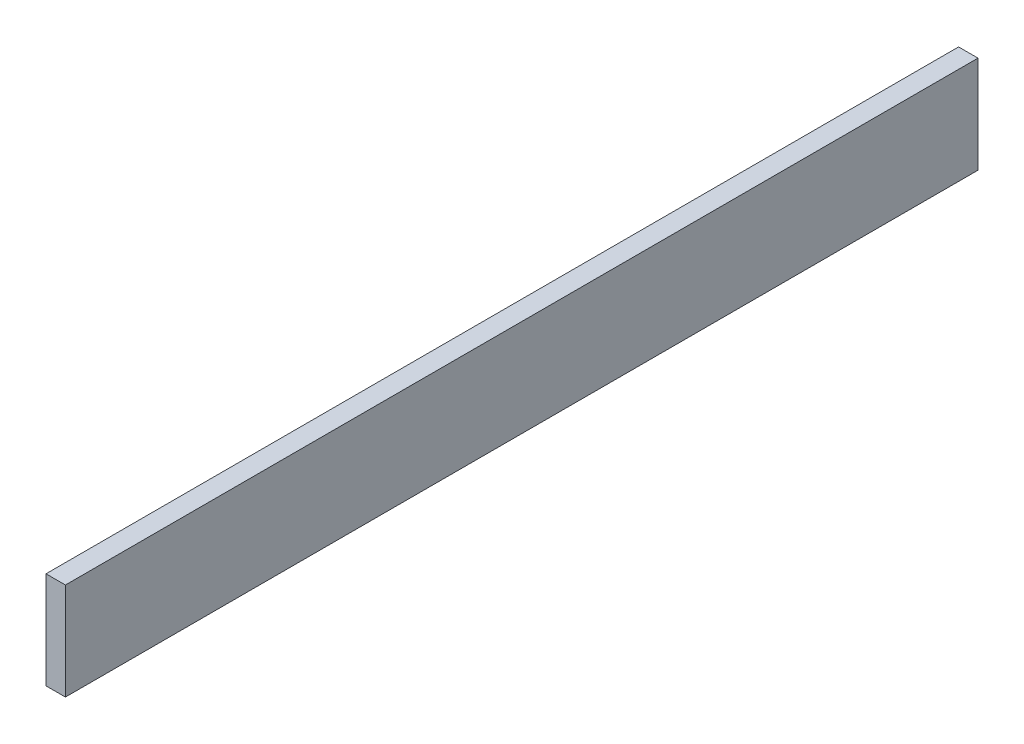
ISO-10303-21;
HEADER;
FILE_DESCRIPTION(('STEP AP214'),'2;1');
FILE_NAME('part.step','',(''),(''),'','','');
FILE_SCHEMA(('AUTOMOTIVE_DESIGN { 1 0 10303 214 1 1 1 1 }'));
ENDSEC;
DATA;
#1=APPLICATION_CONTEXT('core data for automotive mechanical design processes');
#2=APPLICATION_PROTOCOL_DEFINITION('international standard','automotive_design',2000,#1);
#3=PRODUCT_CONTEXT('',#1,'mechanical');
#4=PRODUCT('Part','Part','',(#3));
#5=PRODUCT_RELATED_PRODUCT_CATEGORY('part','',(#4));
#6=PRODUCT_DEFINITION_FORMATION('','',#4);
#7=PRODUCT_DEFINITION_CONTEXT('part definition',#1,'design');
#8=PRODUCT_DEFINITION('design','',#6,#7);
#9=PRODUCT_DEFINITION_SHAPE('','',#8);
#10=(LENGTH_UNIT() NAMED_UNIT(*) SI_UNIT(.MILLI.,.METRE.));
#11=(NAMED_UNIT(*) PLANE_ANGLE_UNIT() SI_UNIT($,.RADIAN.));
#12=(NAMED_UNIT(*) SI_UNIT($,.STERADIAN.) SOLID_ANGLE_UNIT());
#13=UNCERTAINTY_MEASURE_WITH_UNIT(LENGTH_MEASURE(1.E-05),#10,'distance_accuracy_value','');
#14=(GEOMETRIC_REPRESENTATION_CONTEXT(3) GLOBAL_UNCERTAINTY_ASSIGNED_CONTEXT((#13)) GLOBAL_UNIT_ASSIGNED_CONTEXT((#10,
#11,#12)) REPRESENTATION_CONTEXT('',''));
#15=CARTESIAN_POINT('',(0.,0.,0.));
#16=DIRECTION('',(0.,0.,1.));
#17=DIRECTION('',(1.,0.,0.));
#18=AXIS2_PLACEMENT_3D('',#15,#16,#17);
#19=CARTESIAN_POINT('',(10.,0.,0.));
#20=DIRECTION('',(0.,0.,-1.));
#21=DIRECTION('',(-1.,0.,0.));
#22=AXIS2_PLACEMENT_3D('',#19,#20,#21);
#23=PLANE('',#22);
#24=DIRECTION('',(0.,-1.,0.));
#25=VECTOR('',#24,1.);
#26=CARTESIAN_POINT('',(0.,0.,0.));
#27=LINE('',#26,#25);
#28=CARTESIAN_POINT('',(0.,50.,0.));
#29=VERTEX_POINT('',#28);
#30=CARTESIAN_POINT('',(0.,0.,0.));
#31=VERTEX_POINT('',#30);
#32=EDGE_CURVE('E96',#29,#31,#27,.T.);
#33=ORIENTED_EDGE('',*,*,#32,.T.);
#34=DIRECTION('',(-1.,0.,0.));
#35=VECTOR('',#34,1.);
#36=CARTESIAN_POINT('',(10.,0.,0.));
#37=LINE('',#36,#35);
#38=CARTESIAN_POINT('',(10.,0.,0.));
#39=VERTEX_POINT('',#38);
#40=EDGE_CURVE('E11',#39,#31,#37,.T.);
#41=ORIENTED_EDGE('',*,*,#40,.F.);
#42=DIRECTION('',(0.,-1.,0.));
#43=VECTOR('',#42,1.);
#44=CARTESIAN_POINT('',(10.,0.,0.));
#45=LINE('',#44,#43);
#46=CARTESIAN_POINT('',(10.,50.,0.));
#47=VERTEX_POINT('',#46);
#48=EDGE_CURVE('E84',#47,#39,#45,.T.);
#49=ORIENTED_EDGE('',*,*,#48,.F.);
#50=DIRECTION('',(-1.,0.,0.));
#51=VECTOR('',#50,1.);
#52=CARTESIAN_POINT('',(10.,50.,0.));
#53=LINE('',#52,#51);
#54=EDGE_CURVE('E92',#47,#29,#53,.T.);
#55=ORIENTED_EDGE('',*,*,#54,.T.);
#56=EDGE_LOOP('',(#33,#41,#49,#55));
#57=FACE_BOUND('',#56,.T.);
#58=ADVANCED_FACE('F33',(#57),#23,.F.);
#59=CARTESIAN_POINT('',(10.,0.,0.));
#60=DIRECTION('',(0.,1.,0.));
#61=DIRECTION('',(0.,0.,1.));
#62=AXIS2_PLACEMENT_3D('',#59,#60,#61);
#63=PLANE('',#62);
#64=DIRECTION('',(0.,0.,-1.));
#65=VECTOR('',#64,1.);
#66=CARTESIAN_POINT('',(0.,0.,0.));
#67=LINE('',#66,#65);
#68=CARTESIAN_POINT('',(0.,0.,-470.));
#69=VERTEX_POINT('',#68);
#70=EDGE_CURVE('E88',#31,#69,#67,.T.);
#71=ORIENTED_EDGE('',*,*,#70,.T.);
#72=DIRECTION('',(-1.,0.,0.));
#73=VECTOR('',#72,1.);
#74=CARTESIAN_POINT('',(10.,0.,-470.));
#75=LINE('',#74,#73);
#76=CARTESIAN_POINT('',(10.,0.,-470.));
#77=VERTEX_POINT('',#76);
#78=EDGE_CURVE('E41',#77,#69,#75,.T.);
#79=ORIENTED_EDGE('',*,*,#78,.F.);
#80=DIRECTION('',(0.,0.,-1.));
#81=VECTOR('',#80,1.);
#82=CARTESIAN_POINT('',(10.,0.,0.));
#83=LINE('',#82,#81);
#84=EDGE_CURVE('E79',#39,#77,#83,.T.);
#85=ORIENTED_EDGE('',*,*,#84,.F.);
#86=ORIENTED_EDGE('',*,*,#40,.T.);
#87=EDGE_LOOP('',(#71,#79,#85,#86));
#88=FACE_BOUND('',#87,.T.);
#89=ADVANCED_FACE('F87',(#88),#63,.F.);
#90=CARTESIAN_POINT('',(10.,0.,-470.));
#91=DIRECTION('',(0.,0.,1.));
#92=DIRECTION('',(1.,0.,0.));
#93=AXIS2_PLACEMENT_3D('',#90,#91,#92);
#94=PLANE('',#93);
#95=DIRECTION('',(0.,1.,0.));
#96=VECTOR('',#95,1.);
#97=CARTESIAN_POINT('',(0.,0.,-470.));
#98=LINE('',#97,#96);
#99=CARTESIAN_POINT('',(0.,50.0000000000002,-470.));
#100=VERTEX_POINT('',#99);
#101=EDGE_CURVE('E66',#69,#100,#98,.T.);
#102=ORIENTED_EDGE('',*,*,#101,.T.);
#103=DIRECTION('',(-1.,0.,0.));
#104=VECTOR('',#103,1.);
#105=CARTESIAN_POINT('',(10.,50.0000000000002,-470.));
#106=LINE('',#105,#104);
#107=CARTESIAN_POINT('',(10.,50.0000000000002,-470.));
#108=VERTEX_POINT('',#107);
#109=EDGE_CURVE('E89',#108,#100,#106,.T.);
#110=ORIENTED_EDGE('',*,*,#109,.F.);
#111=DIRECTION('',(0.,1.,0.));
#112=VECTOR('',#111,1.);
#113=CARTESIAN_POINT('',(10.,0.,-470.));
#114=LINE('',#113,#112);
#115=EDGE_CURVE('E82',#77,#108,#114,.T.);
#116=ORIENTED_EDGE('',*,*,#115,.F.);
#117=ORIENTED_EDGE('',*,*,#78,.T.);
#118=EDGE_LOOP('',(#102,#110,#116,#117));
#119=FACE_BOUND('',#118,.T.);
#120=ADVANCED_FACE('F90',(#119),#94,.F.);
#121=CARTESIAN_POINT('',(10.,50.0000000000002,-470.));
#122=DIRECTION('',(0.,-1.,0.));
#123=DIRECTION('',(0.,0.,-1.));
#124=AXIS2_PLACEMENT_3D('',#121,#122,#123);
#125=PLANE('',#124);
#126=DIRECTION('',(0.,0.,1.));
#127=VECTOR('',#126,1.);
#128=CARTESIAN_POINT('',(0.,50.0000000000002,-470.));
#129=LINE('',#128,#127);
#130=EDGE_CURVE('E72',#100,#29,#129,.T.);
#131=ORIENTED_EDGE('',*,*,#130,.T.);
#132=ORIENTED_EDGE('',*,*,#54,.F.);
#133=DIRECTION('',(0.,0.,1.));
#134=VECTOR('',#133,1.);
#135=CARTESIAN_POINT('',(10.,50.0000000000002,-470.));
#136=LINE('',#135,#134);
#137=EDGE_CURVE('E49',#108,#47,#136,.T.);
#138=ORIENTED_EDGE('',*,*,#137,.F.);
#139=ORIENTED_EDGE('',*,*,#109,.T.);
#140=EDGE_LOOP('',(#131,#132,#138,#139));
#141=FACE_BOUND('',#140,.T.);
#142=ADVANCED_FACE('F103',(#141),#125,.F.);
#143=CARTESIAN_POINT('',(10.,0.,0.));
#144=DIRECTION('',(1.,0.,0.));
#145=DIRECTION('',(0.,0.,-1.));
#146=AXIS2_PLACEMENT_3D('',#143,#144,#145);
#147=PLANE('',#146);
#148=ORIENTED_EDGE('',*,*,#48,.T.);
#149=ORIENTED_EDGE('',*,*,#84,.T.);
#150=ORIENTED_EDGE('',*,*,#115,.T.);
#151=ORIENTED_EDGE('',*,*,#137,.T.);
#152=EDGE_LOOP('',(#148,#149,#150,#151));
#153=FACE_BOUND('',#152,.T.);
#154=ADVANCED_FACE('F80',(#153),#147,.T.);
#155=CARTESIAN_POINT('',(0.,0.,0.));
#156=DIRECTION('',(1.,0.,0.));
#157=DIRECTION('',(0.,0.,-1.));
#158=AXIS2_PLACEMENT_3D('',#155,#156,#157);
#159=PLANE('',#158);
#160=ORIENTED_EDGE('',*,*,#32,.F.);
#161=ORIENTED_EDGE('',*,*,#130,.F.);
#162=ORIENTED_EDGE('',*,*,#101,.F.);
#163=ORIENTED_EDGE('',*,*,#70,.F.);
#164=EDGE_LOOP('',(#160,#161,#162,#163));
#165=FACE_BOUND('',#164,.T.);
#166=ADVANCED_FACE('F106',(#165),#159,.F.);
#167=CLOSED_SHELL('',(#58,#89,#120,#142,#154,#166));
#168=MANIFOLD_SOLID_BREP('B2',#167);
#169=ADVANCED_BREP_SHAPE_REPRESENTATION('',(#18,#168),#14);
#170=SHAPE_DEFINITION_REPRESENTATION(#9,#169);
ENDSEC;
END-ISO-10303-21;
